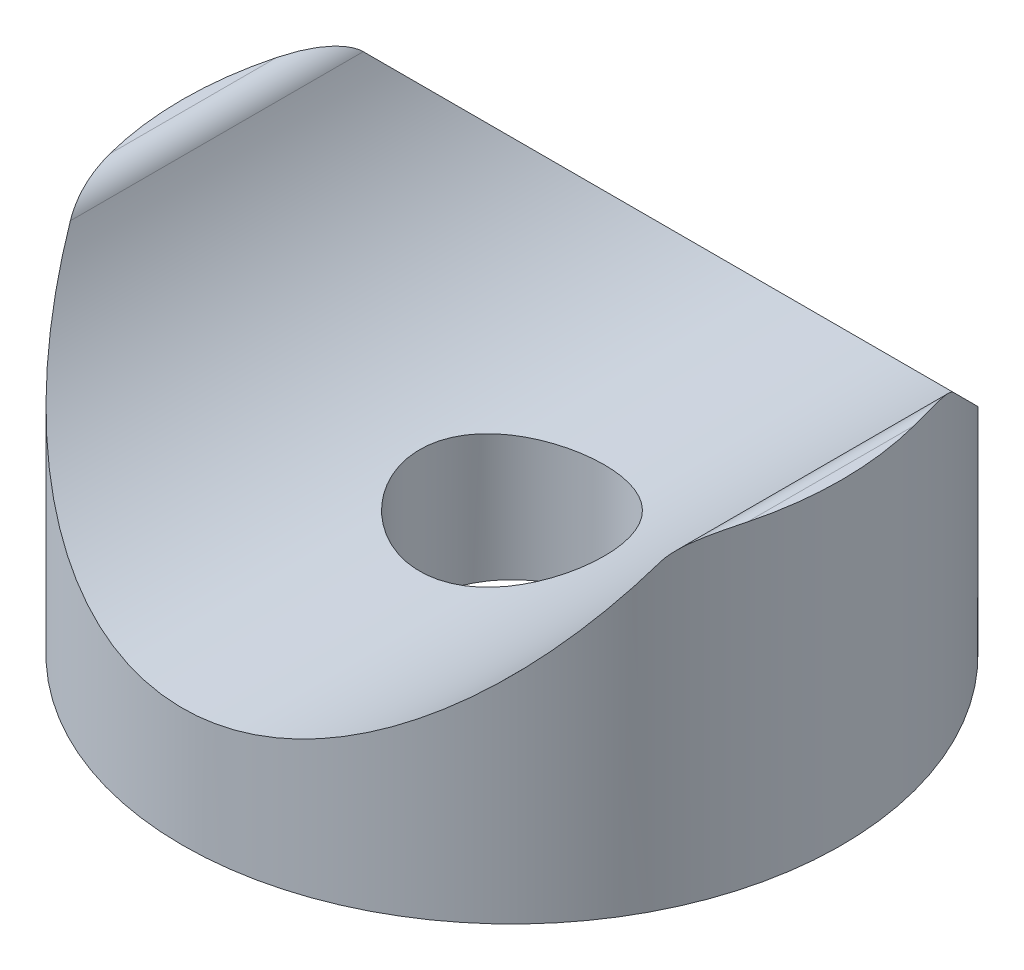
ISO-10303-21;
HEADER;
FILE_DESCRIPTION(('STEP AP214'),'2;1');
FILE_NAME('part.step','',(''),(''),'','','');
FILE_SCHEMA(('AUTOMOTIVE_DESIGN { 1 0 10303 214 1 1 1 1 }'));
ENDSEC;
DATA;
#1=APPLICATION_CONTEXT('core data for automotive mechanical design processes');
#2=APPLICATION_PROTOCOL_DEFINITION('international standard','automotive_design',2000,#1);
#3=PRODUCT_CONTEXT('',#1,'mechanical');
#4=PRODUCT('Part','Part','',(#3));
#5=PRODUCT_RELATED_PRODUCT_CATEGORY('part','',(#4));
#6=PRODUCT_DEFINITION_FORMATION('','',#4);
#7=PRODUCT_DEFINITION_CONTEXT('part definition',#1,'design');
#8=PRODUCT_DEFINITION('design','',#6,#7);
#9=PRODUCT_DEFINITION_SHAPE('','',#8);
#10=(LENGTH_UNIT() NAMED_UNIT(*) SI_UNIT(.MILLI.,.METRE.));
#11=(NAMED_UNIT(*) PLANE_ANGLE_UNIT() SI_UNIT($,.RADIAN.));
#12=(NAMED_UNIT(*) SI_UNIT($,.STERADIAN.) SOLID_ANGLE_UNIT());
#13=UNCERTAINTY_MEASURE_WITH_UNIT(LENGTH_MEASURE(1.E-05),#10,'distance_accuracy_value','');
#14=(GEOMETRIC_REPRESENTATION_CONTEXT(3) GLOBAL_UNCERTAINTY_ASSIGNED_CONTEXT((#13)) GLOBAL_UNIT_ASSIGNED_CONTEXT((#10,
#11,#12)) REPRESENTATION_CONTEXT('',''));
#15=CARTESIAN_POINT('',(0.,0.,0.));
#16=DIRECTION('',(0.,0.,1.));
#17=DIRECTION('',(1.,0.,0.));
#18=AXIS2_PLACEMENT_3D('',#15,#16,#17);
#19=CARTESIAN_POINT('',(0.,12.,0.));
#20=DIRECTION('',(0.,1.,0.));
#21=DIRECTION('',(0.,0.,1.));
#22=AXIS2_PLACEMENT_3D('',#19,#20,#21);
#23=PLANE('',#22);
#24=CARTESIAN_POINT('',(0.,12.,0.));
#25=DIRECTION('',(0.,1.,0.));
#26=DIRECTION('',(0.,0.,1.));
#27=AXIS2_PLACEMENT_3D('',#24,#25,#26);
#28=CIRCLE('',#27,12.5);
#29=CARTESIAN_POINT('',(12.0933866224478,12.,3.16227766016838));
#30=VERTEX_POINT('',#29);
#31=CARTESIAN_POINT('',(12.0933866224478,12.,-3.16227766016838));
#32=VERTEX_POINT('',#31);
#33=EDGE_CURVE('E95',#30,#32,#28,.T.);
#34=ORIENTED_EDGE('',*,*,#33,.T.);
#35=DIRECTION('',(0.,0.,-1.));
#36=VECTOR('',#35,1.);
#37=CARTESIAN_POINT('',(12.0933866224478,12.,0.));
#38=LINE('',#37,#36);
#39=EDGE_CURVE('E81',#32,#30,#38,.F.);
#40=ORIENTED_EDGE('',*,*,#39,.T.);
#41=EDGE_LOOP('',(#34,#40));
#42=FACE_BOUND('',#41,.T.);
#43=ADVANCED_FACE('F39',(#42),#23,.T.);
#44=CARTESIAN_POINT('',(-12.0933866224478,12.,-3.16227766016838));
#45=VERTEX_POINT('',#44);
#46=CARTESIAN_POINT('',(-12.0933866224478,12.,3.16227766016838));
#47=VERTEX_POINT('',#46);
#48=EDGE_CURVE('E98',#45,#47,#28,.T.);
#49=ORIENTED_EDGE('',*,*,#48,.T.);
#50=DIRECTION('',(0.,0.,-1.));
#51=VECTOR('',#50,1.);
#52=CARTESIAN_POINT('',(-12.0933866224478,12.,0.));
#53=LINE('',#52,#51);
#54=EDGE_CURVE('E11',#47,#45,#53,.T.);
#55=ORIENTED_EDGE('',*,*,#54,.T.);
#56=EDGE_LOOP('',(#49,#55));
#57=FACE_BOUND('',#56,.T.);
#58=ADVANCED_FACE('F135',(#57),#23,.T.);
#59=CARTESIAN_POINT('',(0.,12.,0.));
#60=DIRECTION('',(0.,-1.,0.));
#61=DIRECTION('',(0.,0.,-1.));
#62=AXIS2_PLACEMENT_3D('',#59,#60,#61);
#63=CYLINDRICAL_SURFACE('',#62,12.5);
#64=CARTESIAN_POINT('',(0.,0.,0.));
#65=DIRECTION('',(0.,1.,0.));
#66=DIRECTION('',(0.,0.,1.));
#67=AXIS2_PLACEMENT_3D('',#64,#65,#66);
#68=CIRCLE('',#67,12.5);
#69=CARTESIAN_POINT('',(0.,0.,12.5));
#70=VERTEX_POINT('',#69);
#71=EDGE_CURVE('E100',#70,#70,#68,.T.);
#72=ORIENTED_EDGE('',*,*,#71,.T.);
#73=EDGE_LOOP('',(#72));
#74=FACE_BOUND('',#73,.T.);
#75=ORIENTED_EDGE('',*,*,#33,.F.);
#76=CARTESIAN_POINT('',(12.0933866224478,12.,3.16227766016838));
#77=CARTESIAN_POINT('',(12.0714660647053,11.9999899629454,3.24611122545983));
#78=CARTESIAN_POINT('',(12.0486698281743,11.9992782672281,3.32972495093118));
#79=CARTESIAN_POINT('',(12.0013428860638,11.9960403947657,3.4964664059787));
#80=CARTESIAN_POINT('',(11.9768113575259,11.9935133518241,3.57959388444485));
#81=CARTESIAN_POINT('',(11.9257411687449,11.9861883056252,3.74624967600702));
#82=CARTESIAN_POINT('',(11.8991816226525,11.9813628941269,3.82977044854653));
#83=CARTESIAN_POINT('',(11.8443796061588,11.9689096787718,3.99603942484298));
#84=CARTESIAN_POINT('',(11.8161374050414,11.9612823223206,4.07878774978));
#85=CARTESIAN_POINT('',(11.7598106459617,11.943158803194,4.23834526092725));
#86=CARTESIAN_POINT('',(11.7318204203081,11.9328646979385,4.31521026430169));
#87=CARTESIAN_POINT('',(11.6745374705806,11.9085890416992,4.4678649536847));
#88=CARTESIAN_POINT('',(11.6452449525121,11.8946080722155,4.5436548072835));
#89=CARTESIAN_POINT('',(11.58566259823,11.8621846843985,4.69349488801851));
#90=CARTESIAN_POINT('',(11.5553776548682,11.8437619387658,4.76755124859507));
#91=CARTESIAN_POINT('',(11.4939840562347,11.8013201275124,4.9137154413777));
#92=CARTESIAN_POINT('',(11.4628756886583,11.7773029942171,4.98582393680926));
#93=CARTESIAN_POINT('',(11.4116987909782,11.7321230948174,5.10152554803299));
#94=CARTESIAN_POINT('',(11.3917157622215,11.7130811269998,5.14598078996936));
#95=CARTESIAN_POINT('',(11.3518689952023,11.6715513115167,5.23329434782132));
#96=CARTESIAN_POINT('',(11.3320052031367,11.6490651620691,5.27615343787252));
#97=CARTESIAN_POINT('',(11.2923751761044,11.5995055860348,5.36045377138054));
#98=CARTESIAN_POINT('',(11.272617030021,11.5723573547054,5.40185598304289));
#99=CARTESIAN_POINT('',(11.2437517366182,11.5276704491647,5.46155116205611));
#100=CARTESIAN_POINT('',(11.2342348162565,11.5120681248617,5.48109601283609));
#101=CARTESIAN_POINT('',(11.2155852729291,11.4793922787089,5.5191575285814));
#102=CARTESIAN_POINT('',(11.2064531849082,11.4623168033655,5.53767277304284));
#103=CARTESIAN_POINT('',(11.1975802059702,11.4444444444444,5.55555555555555));
#104=B_SPLINE_CURVE_WITH_KNOTS('',3,(#76,#77,#78,#79,#80,#81,#82,#83,#84,#85,#86,#87,#88,#89,
#90,#91,#92,#93,#94,#95,#96,#97,#98,#99,#100,#101,#102,#103),.UNSPECIFIED.,.F.,.F.,(4,2,2,2,2,2,
2,2,2,2,2,2,2,4),(0.,0.259962039539953,0.520048202929994,0.783316676838199,1.04654313114045,
1.29380436795499,1.54102662948744,1.78717342869707,2.03323533349636,2.19010816530437,
2.34690389556712,2.50650201133846,2.58672072449975,2.66704749785341),.UNSPECIFIED.);
#105=CARTESIAN_POINT('',(11.1975802059702,11.4444444444444,5.55555555555556));
#106=VERTEX_POINT('',#105);
#107=EDGE_CURVE('E78',#30,#106,#104,.T.);
#108=ORIENTED_EDGE('',*,*,#107,.T.);
#109=CARTESIAN_POINT('',(0.,17.,0.));
#110=DIRECTION('',(0.,-0.707106781186547,-0.707106781186547));
#111=DIRECTION('',(0.,-0.707106781186547,0.707106781186547));
#112=AXIS2_PLACEMENT_3D('',#109,#110,#111);
#113=ELLIPSE('',#112,17.6776695296637,12.5);
#114=CARTESIAN_POINT('',(-11.1975802059702,11.4444444444444,5.55555555555556));
#115=VERTEX_POINT('',#114);
#116=EDGE_CURVE('E164',#115,#106,#113,.F.);
#117=ORIENTED_EDGE('',*,*,#116,.F.);
#118=CARTESIAN_POINT('',(-11.1975802059702,11.4444444444444,5.55555555555556));
#119=CARTESIAN_POINT('',(-11.2118747869722,11.4731742200461,5.52675340834995));
#120=CARTESIAN_POINT('',(-11.2267984240837,11.4998626631387,5.49638603593253));
#121=CARTESIAN_POINT('',(-11.257437157391,11.5495969047186,5.43335094836975));
#122=CARTESIAN_POINT('',(-11.2731492341473,11.5726553816438,5.40069184293293));
#123=CARTESIAN_POINT('',(-11.3047801323369,11.6154614757108,5.33416286093285));
#124=CARTESIAN_POINT('',(-11.3206928522361,11.6352514476907,5.30031675476468));
#125=CARTESIAN_POINT('',(-11.3527342800179,11.6723354700939,5.23133563619521));
#126=CARTESIAN_POINT('',(-11.3688632119966,11.689626669934,5.19619920819927));
#127=CARTESIAN_POINT('',(-11.4160397271316,11.7369819876932,5.09211864943117));
#128=CARTESIAN_POINT('',(-11.4471339295078,11.7641270772742,5.02186736039672));
#129=CARTESIAN_POINT('',(-11.5087312288836,11.8122184695104,4.87905455894245));
#130=CARTESIAN_POINT('',(-11.5392340103451,11.8331615438991,4.80649186508));
#131=CARTESIAN_POINT('',(-11.5997148281867,11.8703830722578,4.65865726230004));
#132=CARTESIAN_POINT('',(-11.6296783883955,11.8865877965902,4.58336113991443));
#133=CARTESIAN_POINT('',(-11.6883798481046,11.9148933257034,4.43152433259803));
#134=CARTESIAN_POINT('',(-11.7171174035666,11.9269929850682,4.35498330654075));
#135=CARTESIAN_POINT('',(-11.7788155165267,11.9499128872002,4.18559061287074));
#136=CARTESIAN_POINT('',(-11.81147499812,11.9599964830662,4.09253093709537));
#137=CARTESIAN_POINT('',(-11.8746804073779,11.9763355592421,3.90534641319282));
#138=CARTESIAN_POINT('',(-11.9052256889338,11.9825898738484,3.81122124958397));
#139=CARTESIAN_POINT('',(-11.9632361588563,11.9919172869135,3.62494293099321));
#140=CARTESIAN_POINT('',(-11.9907658124465,11.9950791957368,3.5328140350303));
#141=CARTESIAN_POINT('',(-12.0436842584473,11.9991117845348,3.34797151464082));
#142=CARTESIAN_POINT('',(-12.0690747552113,11.9999843055913,3.25525842020293));
#143=CARTESIAN_POINT('',(-12.0933866224478,12.,3.16227766016838));
#144=B_SPLINE_CURVE_WITH_KNOTS('',3,(#118,#119,#120,#121,#122,#123,#124,#125,#126,#127,#128,
#129,#130,#131,#132,#133,#134,#135,#136,#137,#138,#139,#140,#141,#142,#143),.UNSPECIFIED.,.F.,
.F.,(4,2,2,2,2,2,2,2,2,2,2,2,4),(0.,0.129125160403156,0.257788807646838,0.384625908702543,
0.511606581403912,0.755641415836322,0.999803052655362,1.24758317349694,1.49543237444466,
1.79272074658549,2.09009957382791,2.37866264105953,2.66699358019206),.UNSPECIFIED.);
#145=EDGE_CURVE('E92',#115,#47,#144,.T.);
#146=ORIENTED_EDGE('',*,*,#145,.T.);
#147=ORIENTED_EDGE('',*,*,#48,.F.);
#148=CARTESIAN_POINT('',(-12.0933866224478,12.,-3.16227766016838));
#149=CARTESIAN_POINT('',(-12.0714660647053,11.9999899629454,-3.24611122545983));
#150=CARTESIAN_POINT('',(-12.0486698281743,11.9992782672281,-3.32972495093118));
#151=CARTESIAN_POINT('',(-12.0013428860638,11.9960403947657,-3.4964664059787));
#152=CARTESIAN_POINT('',(-11.9768113575259,11.9935133518241,-3.57959388444485));
#153=CARTESIAN_POINT('',(-11.9257411687449,11.9861883056252,-3.74624967600702));
#154=CARTESIAN_POINT('',(-11.8991816226525,11.9813628941269,-3.82977044854653));
#155=CARTESIAN_POINT('',(-11.8443796061588,11.9689096787718,-3.99603942484298));
#156=CARTESIAN_POINT('',(-11.8161374050414,11.9612823223206,-4.07878774978));
#157=CARTESIAN_POINT('',(-11.7598106459617,11.943158803194,-4.23834526092725));
#158=CARTESIAN_POINT('',(-11.7318204203081,11.9328646979385,-4.31521026430169));
#159=CARTESIAN_POINT('',(-11.6745374705806,11.9085890416992,-4.4678649536847));
#160=CARTESIAN_POINT('',(-11.6452449525121,11.8946080722155,-4.5436548072835));
#161=CARTESIAN_POINT('',(-11.58566259823,11.8621846843985,-4.69349488801851));
#162=CARTESIAN_POINT('',(-11.5553776548682,11.8437619387658,-4.76755124859507));
#163=CARTESIAN_POINT('',(-11.4939840562347,11.8013201275124,-4.9137154413777));
#164=CARTESIAN_POINT('',(-11.4628756886583,11.7773029942171,-4.98582393680926));
#165=CARTESIAN_POINT('',(-11.4116987909782,11.7321230948174,-5.10152554803299));
#166=CARTESIAN_POINT('',(-11.3917157622215,11.7130811269998,-5.14598078996936));
#167=CARTESIAN_POINT('',(-11.3518689952023,11.6715513115167,-5.23329434782132));
#168=CARTESIAN_POINT('',(-11.3320052031367,11.6490651620691,-5.27615343787252));
#169=CARTESIAN_POINT('',(-11.2923751761044,11.5995055860348,-5.36045377138054));
#170=CARTESIAN_POINT('',(-11.272617030021,11.5723573547054,-5.40185598304289));
#171=CARTESIAN_POINT('',(-11.2437517366182,11.5276704491647,-5.46155116205611));
#172=CARTESIAN_POINT('',(-11.2342348162565,11.5120681248617,-5.48109601283609));
#173=CARTESIAN_POINT('',(-11.2155852729291,11.4793922787089,-5.5191575285814));
#174=CARTESIAN_POINT('',(-11.2064531849082,11.4623168033655,-5.53767277304284));
#175=CARTESIAN_POINT('',(-11.1975802059702,11.4444444444444,-5.55555555555555));
#176=B_SPLINE_CURVE_WITH_KNOTS('',3,(#148,#149,#150,#151,#152,#153,#154,#155,#156,#157,#158,
#159,#160,#161,#162,#163,#164,#165,#166,#167,#168,#169,#170,#171,#172,#173,#174,#175),
.UNSPECIFIED.,.F.,.F.,(4,2,2,2,2,2,2,2,2,2,2,2,2,4),(0.,0.259962039539953,0.520048202929994,
0.783316676838199,1.04654313114045,1.29380436795499,1.54102662948744,1.78717342869707,
2.03323533349636,2.19010816530437,2.34690389556712,2.50650201133846,2.58672072449975,
2.66704749785341),.UNSPECIFIED.);
#177=CARTESIAN_POINT('',(-11.1975802059702,11.4444444444444,-5.55555555555556));
#178=VERTEX_POINT('',#177);
#179=EDGE_CURVE('E54',#45,#178,#176,.T.);
#180=ORIENTED_EDGE('',*,*,#179,.T.);
#181=CARTESIAN_POINT('',(0.,17.,0.));
#182=DIRECTION('',(0.,-0.707106781186547,0.707106781186547));
#183=DIRECTION('',(0.,-0.707106781186547,-0.707106781186547));
#184=AXIS2_PLACEMENT_3D('',#181,#182,#183);
#185=ELLIPSE('',#184,17.6776695296637,12.5);
#186=CARTESIAN_POINT('',(11.1975802059702,11.4444444444444,-5.55555555555556));
#187=VERTEX_POINT('',#186);
#188=EDGE_CURVE('E113',#187,#178,#185,.F.);
#189=ORIENTED_EDGE('',*,*,#188,.F.);
#190=CARTESIAN_POINT('',(11.1975802059702,11.4444444444444,-5.55555555555556));
#191=CARTESIAN_POINT('',(11.2118747869722,11.4731742200461,-5.52675340834995));
#192=CARTESIAN_POINT('',(11.2267984240837,11.4998626631387,-5.49638603593253));
#193=CARTESIAN_POINT('',(11.257437157391,11.5495969047186,-5.43335094836975));
#194=CARTESIAN_POINT('',(11.2731492341473,11.5726553816438,-5.40069184293293));
#195=CARTESIAN_POINT('',(11.3047801323369,11.6154614757108,-5.33416286093285));
#196=CARTESIAN_POINT('',(11.3206928522361,11.6352514476907,-5.30031675476468));
#197=CARTESIAN_POINT('',(11.3527342800179,11.6723354700939,-5.23133563619521));
#198=CARTESIAN_POINT('',(11.3688632119966,11.689626669934,-5.19619920819927));
#199=CARTESIAN_POINT('',(11.4160397271316,11.7369819876932,-5.09211864943117));
#200=CARTESIAN_POINT('',(11.4471339295078,11.7641270772742,-5.02186736039672));
#201=CARTESIAN_POINT('',(11.5087312288836,11.8122184695104,-4.87905455894245));
#202=CARTESIAN_POINT('',(11.5392340103451,11.8331615438991,-4.80649186508));
#203=CARTESIAN_POINT('',(11.5997148281867,11.8703830722578,-4.65865726230004));
#204=CARTESIAN_POINT('',(11.6296783883955,11.8865877965902,-4.58336113991443));
#205=CARTESIAN_POINT('',(11.6883798481046,11.9148933257034,-4.43152433259803));
#206=CARTESIAN_POINT('',(11.7171174035666,11.9269929850682,-4.35498330654075));
#207=CARTESIAN_POINT('',(11.7788155165267,11.9499128872002,-4.18559061287074));
#208=CARTESIAN_POINT('',(11.81147499812,11.9599964830662,-4.09253093709537));
#209=CARTESIAN_POINT('',(11.8746804073779,11.9763355592421,-3.90534641319282));
#210=CARTESIAN_POINT('',(11.9052256889338,11.9825898738484,-3.81122124958397));
#211=CARTESIAN_POINT('',(11.9632361588563,11.9919172869135,-3.62494293099321));
#212=CARTESIAN_POINT('',(11.9907658124465,11.9950791957368,-3.5328140350303));
#213=CARTESIAN_POINT('',(12.0436842584473,11.9991117845348,-3.34797151464082));
#214=CARTESIAN_POINT('',(12.0690747552113,11.9999843055913,-3.25525842020293));
#215=CARTESIAN_POINT('',(12.0933866224478,12.,-3.16227766016838));
#216=B_SPLINE_CURVE_WITH_KNOTS('',3,(#190,#191,#192,#193,#194,#195,#196,#197,#198,#199,#200,
#201,#202,#203,#204,#205,#206,#207,#208,#209,#210,#211,#212,#213,#214,#215),.UNSPECIFIED.,.F.,
.F.,(4,2,2,2,2,2,2,2,2,2,2,2,4),(0.,0.129125160403156,0.257788807646838,0.384625908702543,
0.511606581403912,0.755641415836322,0.999803052655362,1.24758317349694,1.49543237444466,
1.79272074658549,2.09009957382791,2.37866264105953,2.66699358019206),.UNSPECIFIED.);
#217=EDGE_CURVE('E89',#187,#32,#216,.T.);
#218=ORIENTED_EDGE('',*,*,#217,.T.);
#219=EDGE_LOOP('',(#75,#108,#117,#146,#147,#180,#189,#218));
#220=FACE_BOUND('',#219,.T.);
#221=ADVANCED_FACE('F94',(#74,#220),#63,.T.);
#222=CARTESIAN_POINT('',(0.,12.,0.));
#223=DIRECTION('',(0.,-1.,0.));
#224=DIRECTION('',(0.,0.,-1.));
#225=AXIS2_PLACEMENT_3D('',#222,#223,#224);
#226=CYLINDRICAL_SURFACE('',#225,3.5);
#227=CARTESIAN_POINT('',(0.,0.,0.));
#228=DIRECTION('',(0.,1.,0.));
#229=DIRECTION('',(0.,0.,1.));
#230=AXIS2_PLACEMENT_3D('',#227,#228,#229);
#231=CIRCLE('',#230,3.5);
#232=CARTESIAN_POINT('',(0.,0.,3.5));
#233=VERTEX_POINT('',#232);
#234=EDGE_CURVE('E105',#233,#233,#231,.T.);
#235=ORIENTED_EDGE('',*,*,#234,.F.);
#236=EDGE_LOOP('',(#235));
#237=FACE_BOUND('',#236,.T.);
#238=CARTESIAN_POINT('',(0.,4.5,-3.5));
#239=CARTESIAN_POINT('',(-0.192581786432429,4.50000249925759,-3.49999622344725));
#240=CARTESIAN_POINT('',(-0.385202841850111,4.50449385236466,-3.48405216397538));
#241=CARTESIAN_POINT('',(-0.764872492724589,4.52197362272101,-3.4208248623235));
#242=CARTESIAN_POINT('',(-0.951918771800695,4.53496552196297,-3.37352877762641));
#243=CARTESIAN_POINT('',(-1.31490539699251,4.56801641997674,-3.24927336686093));
#244=CARTESIAN_POINT('',(-1.49086049488397,4.58806578770734,-3.17235445247786));
#245=CARTESIAN_POINT('',(-1.82737460902336,4.63312641601501,-2.99119288637455));
#246=CARTESIAN_POINT('',(-1.98793218813441,4.65813813908925,-2.8869476875223));
#247=CARTESIAN_POINT('',(-2.29316269398827,4.71114445248676,-2.65130523551646));
#248=CARTESIAN_POINT('',(-2.43738992472366,4.73919405498581,-2.51934304681592));
#249=CARTESIAN_POINT('',(-2.70198324958883,4.79477146062894,-2.23321872314655));
#250=CARTESIAN_POINT('',(-2.82234592658727,4.82229918853691,-2.07905341439288));
#251=CARTESIAN_POINT('',(-3.03803257364183,4.87428603504631,-1.74925918638115));
#252=CARTESIAN_POINT('',(-3.13283176983097,4.89867613579131,-1.57327517540349));
#253=CARTESIAN_POINT('',(-3.29131572081522,4.9408120926523,-1.20707175026198));
#254=CARTESIAN_POINT('',(-3.355006872602,4.95855931462013,-1.01685527211786));
#255=CARTESIAN_POINT('',(-3.44789588123108,4.98483006741524,-0.632550285771187));
#256=CARTESIAN_POINT('',(-3.47790722624806,4.99357069217012,-0.438673618769912));
#257=CARTESIAN_POINT('',(-3.50512258314483,5.00148617784364,-0.0484554072528434));
#258=CARTESIAN_POINT('',(-3.50233341310199,5.0006630267365,0.147885616533676));
#259=CARTESIAN_POINT('',(-3.46467006199241,4.98973754203593,0.531009268668086));
#260=CARTESIAN_POINT('',(-3.43079335621037,4.97992370029585,0.717899510613149));
#261=CARTESIAN_POINT('',(-3.33351956343606,4.95258638486965,1.08323089187034));
#262=CARTESIAN_POINT('',(-3.27011990246204,4.93506223896204,1.26167129298178));
#263=CARTESIAN_POINT('',(-3.1148177649034,4.89403436295234,1.60757538307304));
#264=CARTESIAN_POINT('',(-3.02257583298693,4.87046005184268,1.77487793845724));
#265=CARTESIAN_POINT('',(-2.81244397666559,4.82002444873327,2.09197398887639));
#266=CARTESIAN_POINT('',(-2.69454854267015,4.79316245118172,2.24176371204832));
#267=CARTESIAN_POINT('',(-2.43141258810751,4.73798914092408,2.52526565395143));
#268=CARTESIAN_POINT('',(-2.28533812225345,4.70966052597534,2.6582016528868));
#269=CARTESIAN_POINT('',(-1.97261949586361,4.65561201616337,2.89785782504976));
#270=CARTESIAN_POINT('',(-1.80597435216153,4.6298922460958,3.00457674451436));
#271=CARTESIAN_POINT('',(-1.455562417221,4.58377324666123,3.18916031980393));
#272=CARTESIAN_POINT('',(-1.27171122278297,4.56340233480636,3.26687228780382));
#273=CARTESIAN_POINT('',(-0.892850306199755,4.53048047639571,3.39005443541079));
#274=CARTESIAN_POINT('',(-0.69784329362434,4.51792763968528,3.43553240851));
#275=CARTESIAN_POINT('',(-0.30882066916426,4.50234725488833,3.49170853847885));
#276=CARTESIAN_POINT('',(-0.114968581645328,4.49903114505343,3.5034606809037));
#277=CARTESIAN_POINT('',(0.271941065530687,4.50146166696275,3.49477907215689));
#278=CARTESIAN_POINT('',(0.464998713878702,4.50720725793812,3.47434901722636));
#279=CARTESIAN_POINT('',(0.84099378122068,4.52692813610578,3.40274316252071));
#280=CARTESIAN_POINT('',(1.02405441412387,4.54074306273258,3.35216607931219));
#281=CARTESIAN_POINT('',(1.37906679932366,4.57502481238263,3.22240679169541));
#282=CARTESIAN_POINT('',(1.55101728702506,4.59549239104042,3.14322133772115));
#283=CARTESIAN_POINT('',(1.88294014438559,4.64147165515507,2.95661080837825));
#284=CARTESIAN_POINT('',(2.04258441755794,4.66708039876042,2.84862668032885));
#285=CARTESIAN_POINT('',(2.34185264235096,4.72038800269996,2.60817748277237));
#286=CARTESIAN_POINT('',(2.48147221053594,4.74808731864418,2.47570706766433));
#287=CARTESIAN_POINT('',(2.74124847182569,4.80353426080402,2.18511090683426));
#288=CARTESIAN_POINT('',(2.8606586377708,4.83125622919261,2.02631158744512));
#289=CARTESIAN_POINT('',(3.07116633542802,4.88266849096194,1.69033373971802));
#290=CARTESIAN_POINT('',(3.16226492505619,4.90635893497331,1.51315589845868));
#291=CARTESIAN_POINT('',(3.31288920451435,4.94674936566545,1.14623883555632));
#292=CARTESIAN_POINT('',(3.37258813043974,4.96348759852559,0.95657517351852));
#293=CARTESIAN_POINT('',(3.45907116606433,4.98805234196704,0.569344637791956));
#294=CARTESIAN_POINT('',(3.48586475988981,4.99588142033809,0.371780058301655));
#295=CARTESIAN_POINT('',(3.50519109192794,5.00151165861472,-0.0179593947727159));
#296=CARTESIAN_POINT('',(3.49892993900549,4.99966585570603,-0.210070209464296));
#297=CARTESIAN_POINT('',(3.45515373432595,4.98698951542174,-0.590379829207989));
#298=CARTESIAN_POINT('',(3.41763964938251,4.97615925598156,-0.778578755090317));
#299=CARTESIAN_POINT('',(3.31315380263801,4.94695513858603,-1.14402948940411));
#300=CARTESIAN_POINT('',(3.2464622928177,4.92865315642697,-1.32136758009748));
#301=CARTESIAN_POINT('',(3.08573143961651,4.8865722414696,-1.66247600495598));
#302=CARTESIAN_POINT('',(2.99168741871274,4.86279237204856,-1.82624401235619));
#303=CARTESIAN_POINT('',(2.77537022531523,4.81147934871078,-2.14125931968461));
#304=CARTESIAN_POINT('',(2.65228593006707,4.78385002976089,-2.29193401288562));
#305=CARTESIAN_POINT('',(2.3828925768985,4.72845964659382,-2.57088177713038));
#306=CARTESIAN_POINT('',(2.23657774476865,4.70069855129083,-2.69914926191998));
#307=CARTESIAN_POINT('',(1.92058605950971,4.64736436050765,-2.93272529910992));
#308=CARTESIAN_POINT('',(1.75042764699192,4.62186088261852,-3.03739974213111));
#309=CARTESIAN_POINT('',(1.394215654653,4.57670329936233,-3.21649652777332));
#310=CARTESIAN_POINT('',(1.2081713074588,4.55704582578338,-3.29093629936728));
#311=CARTESIAN_POINT('',(0.852630454286918,4.52802254337633,-3.39889831779909));
#312=CARTESIAN_POINT('',(0.68451379082088,4.51759453123824,-3.43671792598792));
#313=CARTESIAN_POINT('',(0.344274883305106,4.50358256079825,-3.4872689216269));
#314=CARTESIAN_POINT('',(0.172153131514246,4.49999776585819,-3.50000337594429));
#315=CARTESIAN_POINT('',(0.,4.5,-3.5));
#316=B_SPLINE_CURVE_WITH_KNOTS('',3,(#238,#239,#240,#241,#242,#243,#244,#245,#246,#247,#248,
#249,#250,#251,#252,#253,#254,#255,#256,#257,#258,#259,#260,#261,#262,#263,#264,#265,#266,#267,
#268,#269,#270,#271,#272,#273,#274,#275,#276,#277,#278,#279,#280,#281,#282,#283,#284,#285,#286,
#287,#288,#289,#290,#291,#292,#293,#294,#295,#296,#297,#298,#299,#300,#301,#302,#303,#304,#305,
#306,#307,#308,#309,#310,#311,#312,#313,#314,#315),.UNSPECIFIED.,.T.,.F.,(4,2,2,2,2,2,2,2,2,2,2,
2,2,2,2,2,2,2,2,2,2,2,2,2,2,2,2,2,2,2,2,2,2,2,2,2,2,2,4),(0.,0.57711363681122,1.15446381896118,
1.73102914985236,2.30764824255437,2.89741578318872,3.4872677109041,4.08843803774811,
4.6894846891095,5.27567856382006,5.86175059152532,6.42965148761028,6.99760190584843,
7.57250570738121,8.14753310281592,8.74333212345063,9.33915963106526,9.93808066875276,
10.5368568506715,11.116705026911,11.6964866103576,12.2651204464873,12.8338188928826,
13.4144814985893,13.9952710187777,14.5942506846864,15.1932079658849,15.7888251080066,
16.3842705382934,16.9581428390922,17.5319973877336,18.1004570363354,18.6690139538123,
19.2558694984738,19.8428711416605,20.4441463075237,21.0450743707877,21.5610321385992,
22.0769268223963),.UNSPECIFIED.);
#317=CARTESIAN_POINT('',(0.,4.5,-3.5));
#318=VERTEX_POINT('',#317);
#319=EDGE_CURVE('E106',#318,#318,#316,.T.);
#320=ORIENTED_EDGE('',*,*,#319,.T.);
#321=EDGE_LOOP('',(#320));
#322=FACE_BOUND('',#321,.T.);
#323=ADVANCED_FACE('F114',(#237,#322),#226,.F.);
#324=CARTESIAN_POINT('',(0.,0.,0.));
#325=DIRECTION('',(0.,1.,0.));
#326=DIRECTION('',(0.,0.,1.));
#327=AXIS2_PLACEMENT_3D('',#324,#325,#326);
#328=PLANE('',#327);
#329=ORIENTED_EDGE('',*,*,#71,.F.);
#330=EDGE_LOOP('',(#329));
#331=FACE_BOUND('',#330,.T.);
#332=ORIENTED_EDGE('',*,*,#234,.T.);
#333=EDGE_LOOP('',(#332));
#334=FACE_BOUND('',#333,.T.);
#335=ADVANCED_FACE('F122',(#331,#334),#328,.F.);
#336=CARTESIAN_POINT('',(0.,17.,22.));
#337=DIRECTION('',(0.,0.,-1.));
#338=DIRECTION('',(-1.,0.,0.));
#339=AXIS2_PLACEMENT_3D('',#336,#337,#338);
#340=CYLINDRICAL_SURFACE('',#339,12.5);
#341=ORIENTED_EDGE('',*,*,#319,.F.);
#342=EDGE_LOOP('',(#341));
#343=FACE_BOUND('',#342,.T.);
#344=ORIENTED_EDGE('',*,*,#116,.T.);
#345=DIRECTION('',(0.,0.,-1.));
#346=VECTOR('',#345,1.);
#347=CARTESIAN_POINT('',(11.1975802059702,11.4444444444444,22.));
#348=LINE('',#347,#346);
#349=EDGE_CURVE('E48',#106,#187,#348,.T.);
#350=ORIENTED_EDGE('',*,*,#349,.T.);
#351=ORIENTED_EDGE('',*,*,#188,.T.);
#352=DIRECTION('',(0.,0.,-1.));
#353=VECTOR('',#352,1.);
#354=CARTESIAN_POINT('',(-11.1975802059702,11.4444444444444,22.));
#355=LINE('',#354,#353);
#356=EDGE_CURVE('E90',#178,#115,#355,.F.);
#357=ORIENTED_EDGE('',*,*,#356,.T.);
#358=EDGE_LOOP('',(#344,#350,#351,#357));
#359=FACE_BOUND('',#358,.T.);
#360=ADVANCED_FACE('F117',(#343,#359),#340,.F.);
#361=CARTESIAN_POINT('',(12.0933866224478,11.,22.));
#362=DIRECTION('',(0.,0.,-1.));
#363=DIRECTION('',(-1.,0.,0.));
#364=AXIS2_PLACEMENT_3D('',#361,#362,#363);
#365=CYLINDRICAL_SURFACE('',#364,1.);
#366=ORIENTED_EDGE('',*,*,#217,.F.);
#367=ORIENTED_EDGE('',*,*,#349,.F.);
#368=ORIENTED_EDGE('',*,*,#107,.F.);
#369=ORIENTED_EDGE('',*,*,#39,.F.);
#370=EDGE_LOOP('',(#366,#367,#368,#369));
#371=FACE_BOUND('',#370,.T.);
#372=ADVANCED_FACE('F84',(#371),#365,.T.);
#373=CARTESIAN_POINT('',(-12.0933866224478,11.,22.));
#374=DIRECTION('',(0.,0.,-1.));
#375=DIRECTION('',(-1.,0.,0.));
#376=AXIS2_PLACEMENT_3D('',#373,#374,#375);
#377=CYLINDRICAL_SURFACE('',#376,1.);
#378=ORIENTED_EDGE('',*,*,#145,.F.);
#379=ORIENTED_EDGE('',*,*,#356,.F.);
#380=ORIENTED_EDGE('',*,*,#179,.F.);
#381=ORIENTED_EDGE('',*,*,#54,.F.);
#382=EDGE_LOOP('',(#378,#379,#380,#381));
#383=FACE_BOUND('',#382,.T.);
#384=ADVANCED_FACE('F41',(#383),#377,.T.);
#385=CLOSED_SHELL('',(#43,#58,#221,#323,#335,#360,#372,#384));
#386=MANIFOLD_SOLID_BREP('B2',#385);
#387=ADVANCED_BREP_SHAPE_REPRESENTATION('',(#18,#386),#14);
#388=SHAPE_DEFINITION_REPRESENTATION(#9,#387);
ENDSEC;
END-ISO-10303-21;
